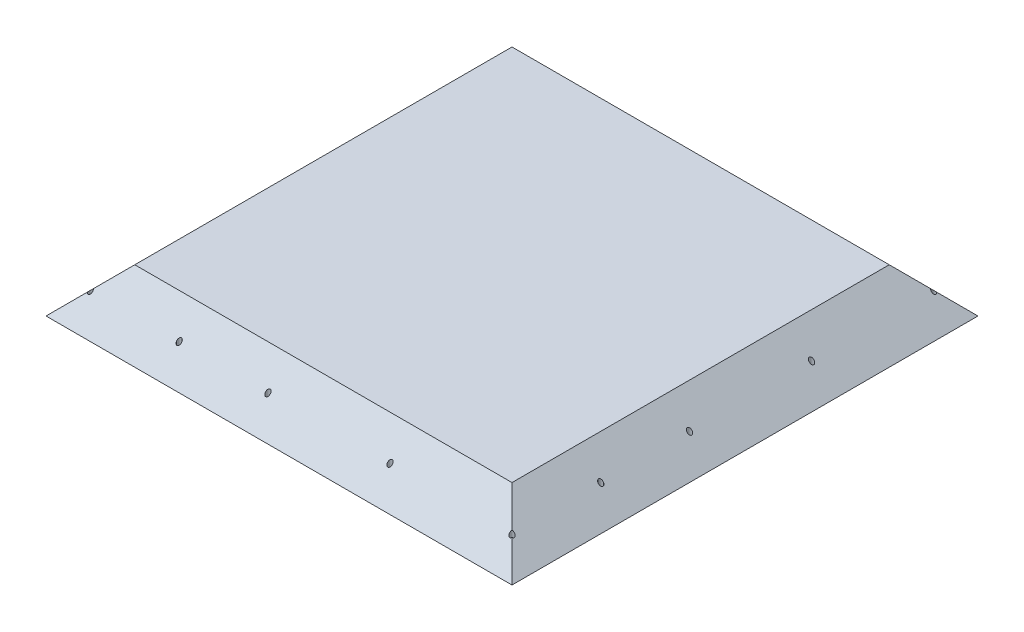
ISO-10303-21;
HEADER;
FILE_DESCRIPTION(('STEP AP214'),'2;1');
FILE_NAME('part.step','',(''),(''),'','','');
FILE_SCHEMA(('AUTOMOTIVE_DESIGN { 1 0 10303 214 1 1 1 1 }'));
ENDSEC;
DATA;
#1=APPLICATION_CONTEXT('core data for automotive mechanical design processes');
#2=APPLICATION_PROTOCOL_DEFINITION('international standard','automotive_design',2000,#1);
#3=PRODUCT_CONTEXT('',#1,'mechanical');
#4=PRODUCT('Part','Part','',(#3));
#5=PRODUCT_RELATED_PRODUCT_CATEGORY('part','',(#4));
#6=PRODUCT_DEFINITION_FORMATION('','',#4);
#7=PRODUCT_DEFINITION_CONTEXT('part definition',#1,'design');
#8=PRODUCT_DEFINITION('design','',#6,#7);
#9=PRODUCT_DEFINITION_SHAPE('','',#8);
#10=(LENGTH_UNIT() NAMED_UNIT(*) SI_UNIT(.MILLI.,.METRE.));
#11=(NAMED_UNIT(*) PLANE_ANGLE_UNIT() SI_UNIT($,.RADIAN.));
#12=(NAMED_UNIT(*) SI_UNIT($,.STERADIAN.) SOLID_ANGLE_UNIT());
#13=UNCERTAINTY_MEASURE_WITH_UNIT(LENGTH_MEASURE(1.E-05),#10,'distance_accuracy_value','');
#14=(GEOMETRIC_REPRESENTATION_CONTEXT(3) GLOBAL_UNCERTAINTY_ASSIGNED_CONTEXT((#13)) GLOBAL_UNIT_ASSIGNED_CONTEXT((#10,
#11,#12)) REPRESENTATION_CONTEXT('',''));
#15=CARTESIAN_POINT('',(0.,0.,0.));
#16=DIRECTION('',(0.,0.,1.));
#17=DIRECTION('',(1.,0.,0.));
#18=AXIS2_PLACEMENT_3D('',#15,#16,#17);
#19=CARTESIAN_POINT('',(0.,20.,0.));
#20=DIRECTION('',(0.,-1.,0.));
#21=DIRECTION('',(0.,0.,-1.));
#22=AXIS2_PLACEMENT_3D('',#19,#20,#21);
#23=PLANE('',#22);
#24=DIRECTION('',(0.,0.,1.));
#25=VECTOR('',#24,1.);
#26=CARTESIAN_POINT('',(20.,20.,0.));
#27=LINE('',#26,#25);
#28=CARTESIAN_POINT('',(20.,20.,-190.));
#29=VERTEX_POINT('',#28);
#30=CARTESIAN_POINT('',(20.,20.,-20.));
#31=VERTEX_POINT('',#30);
#32=EDGE_CURVE('E144',#29,#31,#27,.T.);
#33=ORIENTED_EDGE('',*,*,#32,.T.);
#34=DIRECTION('',(1.,0.,0.));
#35=VECTOR('',#34,1.);
#36=CARTESIAN_POINT('',(0.,20.,-20.));
#37=LINE('',#36,#35);
#38=CARTESIAN_POINT('',(190.,20.,-20.));
#39=VERTEX_POINT('',#38);
#40=EDGE_CURVE('E148',#31,#39,#37,.T.);
#41=ORIENTED_EDGE('',*,*,#40,.T.);
#42=DIRECTION('',(0.,0.,-1.));
#43=VECTOR('',#42,1.);
#44=CARTESIAN_POINT('',(190.,20.,0.));
#45=LINE('',#44,#43);
#46=CARTESIAN_POINT('',(190.,20.,-190.));
#47=VERTEX_POINT('',#46);
#48=EDGE_CURVE('E146',#39,#47,#45,.T.);
#49=ORIENTED_EDGE('',*,*,#48,.T.);
#50=DIRECTION('',(-1.,0.,0.));
#51=VECTOR('',#50,1.);
#52=CARTESIAN_POINT('',(0.,20.,-190.));
#53=LINE('',#52,#51);
#54=EDGE_CURVE('E141',#47,#29,#53,.T.);
#55=ORIENTED_EDGE('',*,*,#54,.T.);
#56=EDGE_LOOP('',(#33,#41,#49,#55));
#57=FACE_BOUND('',#56,.T.);
#58=ADVANCED_FACE('F42',(#57),#23,.F.);
#59=CARTESIAN_POINT('',(0.,0.,0.));
#60=DIRECTION('',(0.,-1.,0.));
#61=DIRECTION('',(0.,0.,-1.));
#62=AXIS2_PLACEMENT_3D('',#59,#60,#61);
#63=PLANE('',#62);
#64=DIRECTION('',(0.,0.,1.));
#65=VECTOR('',#64,1.);
#66=CARTESIAN_POINT('',(0.,0.,0.));
#67=LINE('',#66,#65);
#68=CARTESIAN_POINT('',(0.,0.,-210.));
#69=VERTEX_POINT('',#68);
#70=CARTESIAN_POINT('',(0.,0.,0.));
#71=VERTEX_POINT('',#70);
#72=EDGE_CURVE('E122',#69,#71,#67,.T.);
#73=ORIENTED_EDGE('',*,*,#72,.F.);
#74=DIRECTION('',(-1.,0.,0.));
#75=VECTOR('',#74,1.);
#76=CARTESIAN_POINT('',(0.,0.,-210.));
#77=LINE('',#76,#75);
#78=CARTESIAN_POINT('',(210.,0.,-210.));
#79=VERTEX_POINT('',#78);
#80=EDGE_CURVE('E136',#79,#69,#77,.T.);
#81=ORIENTED_EDGE('',*,*,#80,.F.);
#82=DIRECTION('',(0.,0.,-1.));
#83=VECTOR('',#82,1.);
#84=CARTESIAN_POINT('',(210.,0.,0.));
#85=LINE('',#84,#83);
#86=CARTESIAN_POINT('',(210.,0.,0.));
#87=VERTEX_POINT('',#86);
#88=EDGE_CURVE('E134',#87,#79,#85,.T.);
#89=ORIENTED_EDGE('',*,*,#88,.F.);
#90=DIRECTION('',(1.,0.,0.));
#91=VECTOR('',#90,1.);
#92=CARTESIAN_POINT('',(0.,0.,0.));
#93=LINE('',#92,#91);
#94=EDGE_CURVE('E115',#71,#87,#93,.T.);
#95=ORIENTED_EDGE('',*,*,#94,.F.);
#96=EDGE_LOOP('',(#73,#81,#89,#95));
#97=FACE_BOUND('',#96,.T.);
#98=ADVANCED_FACE('F132',(#97),#63,.T.);
#99=CARTESIAN_POINT('',(10.,3.,-10.));
#100=DIRECTION('',(0.,1.,0.));
#101=DIRECTION('',(0.,0.,1.));
#102=AXIS2_PLACEMENT_3D('',#99,#100,#101);
#103=CYLINDRICAL_SURFACE('',#102,0.999999999999999);
#104=CARTESIAN_POINT('',(10.,9.99999999999996,-10.));
#105=DIRECTION('',(0.707106781186549,-0.707106781186547,0.));
#106=DIRECTION('',(0.707106781186547,0.707106781186549,0.));
#107=AXIS2_PLACEMENT_3D('',#104,#105,#106);
#108=ELLIPSE('',#107,1.4142135623731,0.999999999999999);
#109=CARTESIAN_POINT('',(9.29289321881345,9.29289321881341,-9.29289321881345));
#110=VERTEX_POINT('',#109);
#111=CARTESIAN_POINT('',(10.7071067811865,10.7071067811865,-10.7071067811865));
#112=VERTEX_POINT('',#111);
#113=EDGE_CURVE('E151',#110,#112,#108,.T.);
#114=ORIENTED_EDGE('',*,*,#113,.F.);
#115=CARTESIAN_POINT('',(10.,9.99999999999996,-10.));
#116=DIRECTION('',(0.,-0.707106781186547,-0.707106781186549));
#117=DIRECTION('',(0.,0.707106781186549,-0.707106781186547));
#118=AXIS2_PLACEMENT_3D('',#115,#116,#117);
#119=ELLIPSE('',#118,1.4142135623731,0.999999999999999);
#120=EDGE_CURVE('E118',#110,#112,#119,.F.);
#121=ORIENTED_EDGE('',*,*,#120,.T.);
#122=EDGE_LOOP('',(#114,#121));
#123=FACE_BOUND('',#122,.T.);
#124=CARTESIAN_POINT('',(10.,3.,-10.));
#125=DIRECTION('',(0.,1.,0.));
#126=DIRECTION('',(0.,0.,1.));
#127=AXIS2_PLACEMENT_3D('',#124,#125,#126);
#128=CIRCLE('',#127,0.999999999999999);
#129=CARTESIAN_POINT('',(10.,3.,-9.));
#130=VERTEX_POINT('',#129);
#131=EDGE_CURVE('E130',#130,#130,#128,.T.);
#132=ORIENTED_EDGE('',*,*,#131,.F.);
#133=EDGE_LOOP('',(#132));
#134=FACE_BOUND('',#133,.T.);
#135=ADVANCED_FACE('F244',(#123,#134),#103,.F.);
#136=CARTESIAN_POINT('',(10.,3.,-10.));
#137=DIRECTION('',(0.,1.,0.));
#138=DIRECTION('',(0.,0.,1.));
#139=AXIS2_PLACEMENT_3D('',#136,#137,#138);
#140=PLANE('',#139);
#141=ORIENTED_EDGE('',*,*,#131,.T.);
#142=EDGE_LOOP('',(#141));
#143=FACE_BOUND('',#142,.T.);
#144=ADVANCED_FACE('F242',(#143),#140,.T.);
#145=CARTESIAN_POINT('',(200.,3.,-50.));
#146=DIRECTION('',(0.,1.,0.));
#147=DIRECTION('',(0.,0.,1.));
#148=AXIS2_PLACEMENT_3D('',#145,#146,#147);
#149=CYLINDRICAL_SURFACE('',#148,0.999999999999998);
#150=CARTESIAN_POINT('',(200.,3.,-50.));
#151=DIRECTION('',(0.,1.,0.));
#152=DIRECTION('',(0.,0.,1.));
#153=AXIS2_PLACEMENT_3D('',#150,#151,#152);
#154=CIRCLE('',#153,0.999999999999998);
#155=CARTESIAN_POINT('',(200.,3.,-49.));
#156=VERTEX_POINT('',#155);
#157=EDGE_CURVE('E160',#156,#156,#154,.T.);
#158=ORIENTED_EDGE('',*,*,#157,.F.);
#159=EDGE_LOOP('',(#158));
#160=FACE_BOUND('',#159,.T.);
#161=CARTESIAN_POINT('',(200.,9.99999999999996,-50.));
#162=DIRECTION('',(-0.707106781186549,-0.707106781186547,0.));
#163=DIRECTION('',(-0.707106781186547,0.707106781186549,0.));
#164=AXIS2_PLACEMENT_3D('',#161,#162,#163);
#165=ELLIPSE('',#164,1.41421356237309,0.999999999999998);
#166=CARTESIAN_POINT('',(199.,11.,-50.));
#167=VERTEX_POINT('',#166);
#168=EDGE_CURVE('E165',#167,#167,#165,.F.);
#169=ORIENTED_EDGE('',*,*,#168,.T.);
#170=EDGE_LOOP('',(#169));
#171=FACE_BOUND('',#170,.T.);
#172=ADVANCED_FACE('F252',(#160,#171),#149,.F.);
#173=CARTESIAN_POINT('',(200.,3.,-50.));
#174=DIRECTION('',(0.,1.,0.));
#175=DIRECTION('',(0.,0.,1.));
#176=AXIS2_PLACEMENT_3D('',#173,#174,#175);
#177=PLANE('',#176);
#178=ORIENTED_EDGE('',*,*,#157,.T.);
#179=EDGE_LOOP('',(#178));
#180=FACE_BOUND('',#179,.T.);
#181=ADVANCED_FACE('F364',(#180),#177,.T.);
#182=CARTESIAN_POINT('',(200.,3.,-90.));
#183=DIRECTION('',(0.,1.,0.));
#184=DIRECTION('',(0.,0.,1.));
#185=AXIS2_PLACEMENT_3D('',#182,#183,#184);
#186=CYLINDRICAL_SURFACE('',#185,0.999999999999998);
#187=CARTESIAN_POINT('',(200.,3.,-90.));
#188=DIRECTION('',(0.,1.,0.));
#189=DIRECTION('',(0.,0.,1.));
#190=AXIS2_PLACEMENT_3D('',#187,#188,#189);
#191=CIRCLE('',#190,0.999999999999998);
#192=CARTESIAN_POINT('',(200.,3.,-89.));
#193=VERTEX_POINT('',#192);
#194=EDGE_CURVE('E168',#193,#193,#191,.T.);
#195=ORIENTED_EDGE('',*,*,#194,.F.);
#196=EDGE_LOOP('',(#195));
#197=FACE_BOUND('',#196,.T.);
#198=CARTESIAN_POINT('',(200.,9.99999999999996,-90.));
#199=DIRECTION('',(-0.707106781186549,-0.707106781186547,0.));
#200=DIRECTION('',(-0.707106781186547,0.707106781186549,0.));
#201=AXIS2_PLACEMENT_3D('',#198,#199,#200);
#202=ELLIPSE('',#201,1.41421356237309,0.999999999999998);
#203=CARTESIAN_POINT('',(199.,11.,-90.));
#204=VERTEX_POINT('',#203);
#205=EDGE_CURVE('E169',#204,#204,#202,.F.);
#206=ORIENTED_EDGE('',*,*,#205,.T.);
#207=EDGE_LOOP('',(#206));
#208=FACE_BOUND('',#207,.T.);
#209=ADVANCED_FACE('F367',(#197,#208),#186,.F.);
#210=CARTESIAN_POINT('',(200.,3.,-90.));
#211=DIRECTION('',(0.,1.,0.));
#212=DIRECTION('',(0.,0.,1.));
#213=AXIS2_PLACEMENT_3D('',#210,#211,#212);
#214=PLANE('',#213);
#215=ORIENTED_EDGE('',*,*,#194,.T.);
#216=EDGE_LOOP('',(#215));
#217=FACE_BOUND('',#216,.T.);
#218=ADVANCED_FACE('F372',(#217),#214,.T.);
#219=CARTESIAN_POINT('',(200.,3.,-145.));
#220=DIRECTION('',(0.,1.,0.));
#221=DIRECTION('',(0.,0.,1.));
#222=AXIS2_PLACEMENT_3D('',#219,#220,#221);
#223=CYLINDRICAL_SURFACE('',#222,0.999999999999998);
#224=CARTESIAN_POINT('',(200.,3.,-145.));
#225=DIRECTION('',(0.,1.,0.));
#226=DIRECTION('',(0.,0.,1.));
#227=AXIS2_PLACEMENT_3D('',#224,#225,#226);
#228=CIRCLE('',#227,0.999999999999998);
#229=CARTESIAN_POINT('',(200.,3.,-144.));
#230=VERTEX_POINT('',#229);
#231=EDGE_CURVE('E172',#230,#230,#228,.T.);
#232=ORIENTED_EDGE('',*,*,#231,.F.);
#233=EDGE_LOOP('',(#232));
#234=FACE_BOUND('',#233,.T.);
#235=CARTESIAN_POINT('',(200.,9.99999999999996,-145.));
#236=DIRECTION('',(-0.707106781186549,-0.707106781186547,0.));
#237=DIRECTION('',(-0.707106781186547,0.707106781186549,0.));
#238=AXIS2_PLACEMENT_3D('',#235,#236,#237);
#239=ELLIPSE('',#238,1.41421356237309,0.999999999999998);
#240=CARTESIAN_POINT('',(199.,11.,-145.));
#241=VERTEX_POINT('',#240);
#242=EDGE_CURVE('E173',#241,#241,#239,.F.);
#243=ORIENTED_EDGE('',*,*,#242,.T.);
#244=EDGE_LOOP('',(#243));
#245=FACE_BOUND('',#244,.T.);
#246=ADVANCED_FACE('F375',(#234,#245),#223,.F.);
#247=CARTESIAN_POINT('',(200.,3.,-145.));
#248=DIRECTION('',(0.,1.,0.));
#249=DIRECTION('',(0.,0.,1.));
#250=AXIS2_PLACEMENT_3D('',#247,#248,#249);
#251=PLANE('',#250);
#252=ORIENTED_EDGE('',*,*,#231,.T.);
#253=EDGE_LOOP('',(#252));
#254=FACE_BOUND('',#253,.T.);
#255=ADVANCED_FACE('F380',(#254),#251,.T.);
#256=CARTESIAN_POINT('',(145.,3.,-10.));
#257=DIRECTION('',(0.,1.,0.));
#258=DIRECTION('',(0.,0.,1.));
#259=AXIS2_PLACEMENT_3D('',#256,#257,#258);
#260=CYLINDRICAL_SURFACE('',#259,0.999999999999998);
#261=CARTESIAN_POINT('',(145.,3.,-10.));
#262=DIRECTION('',(0.,1.,0.));
#263=DIRECTION('',(0.,0.,1.));
#264=AXIS2_PLACEMENT_3D('',#261,#262,#263);
#265=CIRCLE('',#264,0.999999999999998);
#266=CARTESIAN_POINT('',(145.,3.,-9.));
#267=VERTEX_POINT('',#266);
#268=EDGE_CURVE('E176',#267,#267,#265,.T.);
#269=ORIENTED_EDGE('',*,*,#268,.F.);
#270=EDGE_LOOP('',(#269));
#271=FACE_BOUND('',#270,.T.);
#272=CARTESIAN_POINT('',(145.,9.99999999999996,-10.));
#273=DIRECTION('',(0.,-0.707106781186547,-0.707106781186549));
#274=DIRECTION('',(0.,0.707106781186549,-0.707106781186547));
#275=AXIS2_PLACEMENT_3D('',#272,#273,#274);
#276=ELLIPSE('',#275,1.41421356237309,0.999999999999998);
#277=CARTESIAN_POINT('',(145.,11.,-11.));
#278=VERTEX_POINT('',#277);
#279=EDGE_CURVE('E177',#278,#278,#276,.F.);
#280=ORIENTED_EDGE('',*,*,#279,.T.);
#281=EDGE_LOOP('',(#280));
#282=FACE_BOUND('',#281,.T.);
#283=ADVANCED_FACE('F383',(#271,#282),#260,.F.);
#284=CARTESIAN_POINT('',(145.,3.,-10.));
#285=DIRECTION('',(0.,1.,0.));
#286=DIRECTION('',(0.,0.,1.));
#287=AXIS2_PLACEMENT_3D('',#284,#285,#286);
#288=PLANE('',#287);
#289=ORIENTED_EDGE('',*,*,#268,.T.);
#290=EDGE_LOOP('',(#289));
#291=FACE_BOUND('',#290,.T.);
#292=ADVANCED_FACE('F388',(#291),#288,.T.);
#293=CARTESIAN_POINT('',(90.,3.,-10.));
#294=DIRECTION('',(0.,1.,0.));
#295=DIRECTION('',(0.,0.,1.));
#296=AXIS2_PLACEMENT_3D('',#293,#294,#295);
#297=CYLINDRICAL_SURFACE('',#296,0.999999999999998);
#298=CARTESIAN_POINT('',(90.,3.,-10.));
#299=DIRECTION('',(0.,1.,0.));
#300=DIRECTION('',(0.,0.,1.));
#301=AXIS2_PLACEMENT_3D('',#298,#299,#300);
#302=CIRCLE('',#301,0.999999999999998);
#303=CARTESIAN_POINT('',(90.,3.,-9.));
#304=VERTEX_POINT('',#303);
#305=EDGE_CURVE('E180',#304,#304,#302,.T.);
#306=ORIENTED_EDGE('',*,*,#305,.F.);
#307=EDGE_LOOP('',(#306));
#308=FACE_BOUND('',#307,.T.);
#309=CARTESIAN_POINT('',(90.,9.99999999999996,-10.));
#310=DIRECTION('',(0.,-0.707106781186547,-0.707106781186549));
#311=DIRECTION('',(0.,0.707106781186549,-0.707106781186547));
#312=AXIS2_PLACEMENT_3D('',#309,#310,#311);
#313=ELLIPSE('',#312,1.41421356237309,0.999999999999998);
#314=CARTESIAN_POINT('',(90.,11.,-11.));
#315=VERTEX_POINT('',#314);
#316=EDGE_CURVE('E181',#315,#315,#313,.F.);
#317=ORIENTED_EDGE('',*,*,#316,.T.);
#318=EDGE_LOOP('',(#317));
#319=FACE_BOUND('',#318,.T.);
#320=ADVANCED_FACE('F391',(#308,#319),#297,.F.);
#321=CARTESIAN_POINT('',(90.,3.,-10.));
#322=DIRECTION('',(0.,1.,0.));
#323=DIRECTION('',(0.,0.,1.));
#324=AXIS2_PLACEMENT_3D('',#321,#322,#323);
#325=PLANE('',#324);
#326=ORIENTED_EDGE('',*,*,#305,.T.);
#327=EDGE_LOOP('',(#326));
#328=FACE_BOUND('',#327,.T.);
#329=ADVANCED_FACE('F396',(#328),#325,.T.);
#330=CARTESIAN_POINT('',(50.,3.,-10.));
#331=DIRECTION('',(0.,1.,0.));
#332=DIRECTION('',(0.,0.,1.));
#333=AXIS2_PLACEMENT_3D('',#330,#331,#332);
#334=CYLINDRICAL_SURFACE('',#333,0.999999999999998);
#335=CARTESIAN_POINT('',(50.,3.,-10.));
#336=DIRECTION('',(0.,1.,0.));
#337=DIRECTION('',(0.,0.,1.));
#338=AXIS2_PLACEMENT_3D('',#335,#336,#337);
#339=CIRCLE('',#338,0.999999999999998);
#340=CARTESIAN_POINT('',(50.,3.,-9.));
#341=VERTEX_POINT('',#340);
#342=EDGE_CURVE('E184',#341,#341,#339,.T.);
#343=ORIENTED_EDGE('',*,*,#342,.F.);
#344=EDGE_LOOP('',(#343));
#345=FACE_BOUND('',#344,.T.);
#346=CARTESIAN_POINT('',(50.,9.99999999999996,-10.));
#347=DIRECTION('',(0.,-0.707106781186547,-0.707106781186549));
#348=DIRECTION('',(0.,0.707106781186549,-0.707106781186547));
#349=AXIS2_PLACEMENT_3D('',#346,#347,#348);
#350=ELLIPSE('',#349,1.41421356237309,0.999999999999998);
#351=CARTESIAN_POINT('',(50.,11.,-11.));
#352=VERTEX_POINT('',#351);
#353=EDGE_CURVE('E185',#352,#352,#350,.F.);
#354=ORIENTED_EDGE('',*,*,#353,.T.);
#355=EDGE_LOOP('',(#354));
#356=FACE_BOUND('',#355,.T.);
#357=ADVANCED_FACE('F399',(#345,#356),#334,.F.);
#358=CARTESIAN_POINT('',(50.,3.,-10.));
#359=DIRECTION('',(0.,1.,0.));
#360=DIRECTION('',(0.,0.,1.));
#361=AXIS2_PLACEMENT_3D('',#358,#359,#360);
#362=PLANE('',#361);
#363=ORIENTED_EDGE('',*,*,#342,.T.);
#364=EDGE_LOOP('',(#363));
#365=FACE_BOUND('',#364,.T.);
#366=ADVANCED_FACE('F404',(#365),#362,.T.);
#367=CARTESIAN_POINT('',(10.,3.,-120.));
#368=DIRECTION('',(0.,1.,0.));
#369=DIRECTION('',(0.,0.,1.));
#370=AXIS2_PLACEMENT_3D('',#367,#368,#369);
#371=CYLINDRICAL_SURFACE('',#370,1.);
#372=CARTESIAN_POINT('',(10.,3.,-120.));
#373=DIRECTION('',(0.,1.,0.));
#374=DIRECTION('',(0.,0.,1.));
#375=AXIS2_PLACEMENT_3D('',#372,#373,#374);
#376=CIRCLE('',#375,1.);
#377=CARTESIAN_POINT('',(10.,3.,-119.));
#378=VERTEX_POINT('',#377);
#379=EDGE_CURVE('E188',#378,#378,#376,.T.);
#380=ORIENTED_EDGE('',*,*,#379,.F.);
#381=EDGE_LOOP('',(#380));
#382=FACE_BOUND('',#381,.T.);
#383=CARTESIAN_POINT('',(10.,9.99999999999996,-120.));
#384=DIRECTION('',(0.707106781186549,-0.707106781186547,0.));
#385=DIRECTION('',(0.707106781186547,0.707106781186549,0.));
#386=AXIS2_PLACEMENT_3D('',#383,#384,#385);
#387=ELLIPSE('',#386,1.4142135623731,1.);
#388=CARTESIAN_POINT('',(11.,11.,-120.));
#389=VERTEX_POINT('',#388);
#390=EDGE_CURVE('E189',#389,#389,#387,.F.);
#391=ORIENTED_EDGE('',*,*,#390,.T.);
#392=EDGE_LOOP('',(#391));
#393=FACE_BOUND('',#392,.T.);
#394=ADVANCED_FACE('F407',(#382,#393),#371,.F.);
#395=CARTESIAN_POINT('',(10.,3.,-120.));
#396=DIRECTION('',(0.,1.,0.));
#397=DIRECTION('',(0.,0.,1.));
#398=AXIS2_PLACEMENT_3D('',#395,#396,#397);
#399=PLANE('',#398);
#400=ORIENTED_EDGE('',*,*,#379,.T.);
#401=EDGE_LOOP('',(#400));
#402=FACE_BOUND('',#401,.T.);
#403=ADVANCED_FACE('F326',(#402),#399,.T.);
#404=CARTESIAN_POINT('',(200.,3.,-10.));
#405=DIRECTION('',(0.,1.,0.));
#406=DIRECTION('',(0.,0.,1.));
#407=AXIS2_PLACEMENT_3D('',#404,#405,#406);
#408=CYLINDRICAL_SURFACE('',#407,0.999999999999998);
#409=CARTESIAN_POINT('',(200.,3.,-10.));
#410=DIRECTION('',(0.,1.,0.));
#411=DIRECTION('',(0.,0.,1.));
#412=AXIS2_PLACEMENT_3D('',#409,#410,#411);
#413=CIRCLE('',#412,0.999999999999998);
#414=CARTESIAN_POINT('',(200.,3.,-9.));
#415=VERTEX_POINT('',#414);
#416=EDGE_CURVE('E195',#415,#415,#413,.T.);
#417=ORIENTED_EDGE('',*,*,#416,.F.);
#418=EDGE_LOOP('',(#417));
#419=FACE_BOUND('',#418,.T.);
#420=CARTESIAN_POINT('',(200.,9.99999999999996,-10.));
#421=DIRECTION('',(0.,-0.707106781186547,-0.707106781186549));
#422=DIRECTION('',(0.,0.707106781186549,-0.707106781186547));
#423=AXIS2_PLACEMENT_3D('',#420,#421,#422);
#424=ELLIPSE('',#423,1.41421356237309,0.999999999999998);
#425=CARTESIAN_POINT('',(199.292893218813,10.7071067811865,-10.7071067811865));
#426=VERTEX_POINT('',#425);
#427=CARTESIAN_POINT('',(200.707106781187,9.29289321881341,-9.29289321881345));
#428=VERTEX_POINT('',#427);
#429=EDGE_CURVE('E162',#426,#428,#424,.F.);
#430=ORIENTED_EDGE('',*,*,#429,.T.);
#431=CARTESIAN_POINT('',(200.,9.99999999999996,-10.));
#432=DIRECTION('',(-0.707106781186549,-0.707106781186547,0.));
#433=DIRECTION('',(-0.707106781186547,0.707106781186549,0.));
#434=AXIS2_PLACEMENT_3D('',#431,#432,#433);
#435=ELLIPSE('',#434,1.41421356237309,0.999999999999998);
#436=EDGE_CURVE('E164',#428,#426,#435,.F.);
#437=ORIENTED_EDGE('',*,*,#436,.T.);
#438=EDGE_LOOP('',(#430,#437));
#439=FACE_BOUND('',#438,.T.);
#440=ADVANCED_FACE('F322',(#419,#439),#408,.F.);
#441=CARTESIAN_POINT('',(200.,3.,-10.));
#442=DIRECTION('',(0.,1.,0.));
#443=DIRECTION('',(0.,0.,1.));
#444=AXIS2_PLACEMENT_3D('',#441,#442,#443);
#445=PLANE('',#444);
#446=ORIENTED_EDGE('',*,*,#416,.T.);
#447=EDGE_LOOP('',(#446));
#448=FACE_BOUND('',#447,.T.);
#449=ADVANCED_FACE('F325',(#448),#445,.T.);
#450=CARTESIAN_POINT('',(200.,3.,-200.));
#451=DIRECTION('',(0.,1.,0.));
#452=DIRECTION('',(0.,0.,1.));
#453=AXIS2_PLACEMENT_3D('',#450,#451,#452);
#454=CYLINDRICAL_SURFACE('',#453,0.999999999999998);
#455=CARTESIAN_POINT('',(200.,9.99999999999996,-200.));
#456=DIRECTION('',(-0.707106781186549,-0.707106781186547,0.));
#457=DIRECTION('',(-0.707106781186547,0.707106781186549,0.));
#458=AXIS2_PLACEMENT_3D('',#455,#456,#457);
#459=ELLIPSE('',#458,1.41421356237309,0.999999999999998);
#460=CARTESIAN_POINT('',(200.707106781187,9.2928932188134,-200.707106781187));
#461=VERTEX_POINT('',#460);
#462=CARTESIAN_POINT('',(199.292893218813,10.7071067811865,-199.292893218813));
#463=VERTEX_POINT('',#462);
#464=EDGE_CURVE('E52',#461,#463,#459,.T.);
#465=ORIENTED_EDGE('',*,*,#464,.F.);
#466=CARTESIAN_POINT('',(200.,9.99999999999996,-200.));
#467=DIRECTION('',(0.,-0.707106781186547,0.707106781186549));
#468=DIRECTION('',(0.,0.707106781186549,0.707106781186547));
#469=AXIS2_PLACEMENT_3D('',#466,#467,#468);
#470=ELLIPSE('',#469,1.41421356237309,0.999999999999998);
#471=EDGE_CURVE('E197',#461,#463,#470,.F.);
#472=ORIENTED_EDGE('',*,*,#471,.T.);
#473=EDGE_LOOP('',(#465,#472));
#474=FACE_BOUND('',#473,.T.);
#475=CARTESIAN_POINT('',(200.,3.,-200.));
#476=DIRECTION('',(0.,1.,0.));
#477=DIRECTION('',(0.,0.,1.));
#478=AXIS2_PLACEMENT_3D('',#475,#476,#477);
#479=CIRCLE('',#478,0.999999999999998);
#480=CARTESIAN_POINT('',(200.,3.,-199.));
#481=VERTEX_POINT('',#480);
#482=EDGE_CURVE('E200',#481,#481,#479,.T.);
#483=ORIENTED_EDGE('',*,*,#482,.F.);
#484=EDGE_LOOP('',(#483));
#485=FACE_BOUND('',#484,.T.);
#486=ADVANCED_FACE('F330',(#474,#485),#454,.F.);
#487=CARTESIAN_POINT('',(200.,3.,-200.));
#488=DIRECTION('',(0.,1.,0.));
#489=DIRECTION('',(0.,0.,1.));
#490=AXIS2_PLACEMENT_3D('',#487,#488,#489);
#491=PLANE('',#490);
#492=ORIENTED_EDGE('',*,*,#482,.T.);
#493=EDGE_LOOP('',(#492));
#494=FACE_BOUND('',#493,.T.);
#495=ADVANCED_FACE('F334',(#494),#491,.T.);
#496=CARTESIAN_POINT('',(10.,3.,-200.));
#497=DIRECTION('',(0.,1.,0.));
#498=DIRECTION('',(0.,0.,1.));
#499=AXIS2_PLACEMENT_3D('',#496,#497,#498);
#500=CYLINDRICAL_SURFACE('',#499,1.);
#501=CARTESIAN_POINT('',(10.,9.99999999999996,-200.));
#502=DIRECTION('',(0.707106781186549,-0.707106781186547,0.));
#503=DIRECTION('',(0.707106781186547,0.707106781186549,0.));
#504=AXIS2_PLACEMENT_3D('',#501,#502,#503);
#505=ELLIPSE('',#504,1.4142135623731,1.);
#506=CARTESIAN_POINT('',(10.7071067811866,10.7071067811865,-199.292893218813));
#507=VERTEX_POINT('',#506);
#508=CARTESIAN_POINT('',(9.29289321881346,9.29289321881341,-200.707106781187));
#509=VERTEX_POINT('',#508);
#510=EDGE_CURVE('E11',#507,#509,#505,.T.);
#511=ORIENTED_EDGE('',*,*,#510,.F.);
#512=CARTESIAN_POINT('',(10.,9.99999999999996,-200.));
#513=DIRECTION('',(0.,-0.707106781186547,0.707106781186549));
#514=DIRECTION('',(0.,0.707106781186549,0.707106781186547));
#515=AXIS2_PLACEMENT_3D('',#512,#513,#514);
#516=ELLIPSE('',#515,1.4142135623731,1.);
#517=EDGE_CURVE('E202',#507,#509,#516,.F.);
#518=ORIENTED_EDGE('',*,*,#517,.T.);
#519=EDGE_LOOP('',(#511,#518));
#520=FACE_BOUND('',#519,.T.);
#521=CARTESIAN_POINT('',(10.,3.,-200.));
#522=DIRECTION('',(0.,1.,0.));
#523=DIRECTION('',(0.,0.,1.));
#524=AXIS2_PLACEMENT_3D('',#521,#522,#523);
#525=CIRCLE('',#524,1.);
#526=CARTESIAN_POINT('',(10.,3.,-199.));
#527=VERTEX_POINT('',#526);
#528=EDGE_CURVE('E203',#527,#527,#525,.T.);
#529=ORIENTED_EDGE('',*,*,#528,.F.);
#530=EDGE_LOOP('',(#529));
#531=FACE_BOUND('',#530,.T.);
#532=ADVANCED_FACE('F338',(#520,#531),#500,.F.);
#533=CARTESIAN_POINT('',(10.,3.,-200.));
#534=DIRECTION('',(0.,1.,0.));
#535=DIRECTION('',(0.,0.,1.));
#536=AXIS2_PLACEMENT_3D('',#533,#534,#535);
#537=PLANE('',#536);
#538=ORIENTED_EDGE('',*,*,#528,.T.);
#539=EDGE_LOOP('',(#538));
#540=FACE_BOUND('',#539,.T.);
#541=ADVANCED_FACE('F342',(#540),#537,.T.);
#542=CARTESIAN_POINT('',(65.,3.,-200.));
#543=DIRECTION('',(0.,1.,0.));
#544=DIRECTION('',(0.,0.,1.));
#545=AXIS2_PLACEMENT_3D('',#542,#543,#544);
#546=CYLINDRICAL_SURFACE('',#545,0.999999999999998);
#547=CARTESIAN_POINT('',(65.,3.,-200.));
#548=DIRECTION('',(0.,1.,0.));
#549=DIRECTION('',(0.,0.,1.));
#550=AXIS2_PLACEMENT_3D('',#547,#548,#549);
#551=CIRCLE('',#550,0.999999999999998);
#552=CARTESIAN_POINT('',(65.,3.,-199.));
#553=VERTEX_POINT('',#552);
#554=EDGE_CURVE('E208',#553,#553,#551,.T.);
#555=ORIENTED_EDGE('',*,*,#554,.F.);
#556=EDGE_LOOP('',(#555));
#557=FACE_BOUND('',#556,.T.);
#558=CARTESIAN_POINT('',(65.,9.99999999999996,-200.));
#559=DIRECTION('',(0.,-0.707106781186547,0.707106781186549));
#560=DIRECTION('',(0.,0.707106781186549,0.707106781186547));
#561=AXIS2_PLACEMENT_3D('',#558,#559,#560);
#562=ELLIPSE('',#561,1.41421356237309,0.999999999999998);
#563=CARTESIAN_POINT('',(65.,11.,-199.));
#564=VERTEX_POINT('',#563);
#565=EDGE_CURVE('E205',#564,#564,#562,.F.);
#566=ORIENTED_EDGE('',*,*,#565,.T.);
#567=EDGE_LOOP('',(#566));
#568=FACE_BOUND('',#567,.T.);
#569=ADVANCED_FACE('F345',(#557,#568),#546,.F.);
#570=CARTESIAN_POINT('',(65.,3.,-200.));
#571=DIRECTION('',(0.,1.,0.));
#572=DIRECTION('',(0.,0.,1.));
#573=AXIS2_PLACEMENT_3D('',#570,#571,#572);
#574=PLANE('',#573);
#575=ORIENTED_EDGE('',*,*,#554,.T.);
#576=EDGE_LOOP('',(#575));
#577=FACE_BOUND('',#576,.T.);
#578=ADVANCED_FACE('F349',(#577),#574,.T.);
#579=CARTESIAN_POINT('',(120.,3.,-200.));
#580=DIRECTION('',(0.,1.,0.));
#581=DIRECTION('',(0.,0.,1.));
#582=AXIS2_PLACEMENT_3D('',#579,#580,#581);
#583=CYLINDRICAL_SURFACE('',#582,0.999999999999998);
#584=CARTESIAN_POINT('',(120.,3.,-200.));
#585=DIRECTION('',(0.,1.,0.));
#586=DIRECTION('',(0.,0.,1.));
#587=AXIS2_PLACEMENT_3D('',#584,#585,#586);
#588=CIRCLE('',#587,0.999999999999998);
#589=CARTESIAN_POINT('',(120.,3.,-199.));
#590=VERTEX_POINT('',#589);
#591=EDGE_CURVE('E212',#590,#590,#588,.T.);
#592=ORIENTED_EDGE('',*,*,#591,.F.);
#593=EDGE_LOOP('',(#592));
#594=FACE_BOUND('',#593,.T.);
#595=CARTESIAN_POINT('',(120.,9.99999999999996,-200.));
#596=DIRECTION('',(0.,-0.707106781186547,0.707106781186549));
#597=DIRECTION('',(0.,0.707106781186549,0.707106781186547));
#598=AXIS2_PLACEMENT_3D('',#595,#596,#597);
#599=ELLIPSE('',#598,1.41421356237309,0.999999999999998);
#600=CARTESIAN_POINT('',(120.,11.,-199.));
#601=VERTEX_POINT('',#600);
#602=EDGE_CURVE('E209',#601,#601,#599,.F.);
#603=ORIENTED_EDGE('',*,*,#602,.T.);
#604=EDGE_LOOP('',(#603));
#605=FACE_BOUND('',#604,.T.);
#606=ADVANCED_FACE('F307',(#594,#605),#583,.F.);
#607=CARTESIAN_POINT('',(120.,3.,-200.));
#608=DIRECTION('',(0.,1.,0.));
#609=DIRECTION('',(0.,0.,1.));
#610=AXIS2_PLACEMENT_3D('',#607,#608,#609);
#611=PLANE('',#610);
#612=ORIENTED_EDGE('',*,*,#591,.T.);
#613=EDGE_LOOP('',(#612));
#614=FACE_BOUND('',#613,.T.);
#615=ADVANCED_FACE('F297',(#614),#611,.T.);
#616=CARTESIAN_POINT('',(160.,3.,-200.));
#617=DIRECTION('',(0.,1.,0.));
#618=DIRECTION('',(0.,0.,1.));
#619=AXIS2_PLACEMENT_3D('',#616,#617,#618);
#620=CYLINDRICAL_SURFACE('',#619,0.999999999999998);
#621=CARTESIAN_POINT('',(160.,3.,-200.));
#622=DIRECTION('',(0.,1.,0.));
#623=DIRECTION('',(0.,0.,1.));
#624=AXIS2_PLACEMENT_3D('',#621,#622,#623);
#625=CIRCLE('',#624,0.999999999999998);
#626=CARTESIAN_POINT('',(160.,3.,-199.));
#627=VERTEX_POINT('',#626);
#628=EDGE_CURVE('E215',#627,#627,#625,.T.);
#629=ORIENTED_EDGE('',*,*,#628,.F.);
#630=EDGE_LOOP('',(#629));
#631=FACE_BOUND('',#630,.T.);
#632=CARTESIAN_POINT('',(160.,9.99999999999996,-200.));
#633=DIRECTION('',(0.,-0.707106781186547,0.707106781186549));
#634=DIRECTION('',(0.,0.707106781186549,0.707106781186547));
#635=AXIS2_PLACEMENT_3D('',#632,#633,#634);
#636=ELLIPSE('',#635,1.41421356237309,0.999999999999998);
#637=CARTESIAN_POINT('',(160.,11.,-199.));
#638=VERTEX_POINT('',#637);
#639=EDGE_CURVE('E213',#638,#638,#636,.F.);
#640=ORIENTED_EDGE('',*,*,#639,.T.);
#641=EDGE_LOOP('',(#640));
#642=FACE_BOUND('',#641,.T.);
#643=ADVANCED_FACE('F294',(#631,#642),#620,.F.);
#644=CARTESIAN_POINT('',(160.,3.,-200.));
#645=DIRECTION('',(0.,1.,0.));
#646=DIRECTION('',(0.,0.,1.));
#647=AXIS2_PLACEMENT_3D('',#644,#645,#646);
#648=PLANE('',#647);
#649=ORIENTED_EDGE('',*,*,#628,.T.);
#650=EDGE_LOOP('',(#649));
#651=FACE_BOUND('',#650,.T.);
#652=ADVANCED_FACE('F296',(#651),#648,.T.);
#653=CARTESIAN_POINT('',(10.,3.,-160.));
#654=DIRECTION('',(0.,1.,0.));
#655=DIRECTION('',(0.,0.,1.));
#656=AXIS2_PLACEMENT_3D('',#653,#654,#655);
#657=CYLINDRICAL_SURFACE('',#656,1.);
#658=CARTESIAN_POINT('',(10.,3.,-160.));
#659=DIRECTION('',(0.,1.,0.));
#660=DIRECTION('',(0.,0.,1.));
#661=AXIS2_PLACEMENT_3D('',#658,#659,#660);
#662=CIRCLE('',#661,1.);
#663=CARTESIAN_POINT('',(10.,3.,-159.));
#664=VERTEX_POINT('',#663);
#665=EDGE_CURVE('E218',#664,#664,#662,.T.);
#666=ORIENTED_EDGE('',*,*,#665,.F.);
#667=EDGE_LOOP('',(#666));
#668=FACE_BOUND('',#667,.T.);
#669=CARTESIAN_POINT('',(10.,9.99999999999996,-160.));
#670=DIRECTION('',(0.707106781186549,-0.707106781186547,0.));
#671=DIRECTION('',(0.707106781186547,0.707106781186549,0.));
#672=AXIS2_PLACEMENT_3D('',#669,#670,#671);
#673=ELLIPSE('',#672,1.4142135623731,1.);
#674=CARTESIAN_POINT('',(11.,11.,-160.));
#675=VERTEX_POINT('',#674);
#676=EDGE_CURVE('E216',#675,#675,#673,.F.);
#677=ORIENTED_EDGE('',*,*,#676,.T.);
#678=EDGE_LOOP('',(#677));
#679=FACE_BOUND('',#678,.T.);
#680=ADVANCED_FACE('F304',(#668,#679),#657,.F.);
#681=CARTESIAN_POINT('',(10.,3.,-160.));
#682=DIRECTION('',(0.,1.,0.));
#683=DIRECTION('',(0.,0.,1.));
#684=AXIS2_PLACEMENT_3D('',#681,#682,#683);
#685=PLANE('',#684);
#686=ORIENTED_EDGE('',*,*,#665,.T.);
#687=EDGE_LOOP('',(#686));
#688=FACE_BOUND('',#687,.T.);
#689=ADVANCED_FACE('F315',(#688),#685,.T.);
#690=CARTESIAN_POINT('',(10.,3.,-65.));
#691=DIRECTION('',(0.,1.,0.));
#692=DIRECTION('',(0.,0.,1.));
#693=AXIS2_PLACEMENT_3D('',#690,#691,#692);
#694=CYLINDRICAL_SURFACE('',#693,1.);
#695=CARTESIAN_POINT('',(10.,3.,-65.));
#696=DIRECTION('',(0.,1.,0.));
#697=DIRECTION('',(0.,0.,1.));
#698=AXIS2_PLACEMENT_3D('',#695,#696,#697);
#699=CIRCLE('',#698,1.);
#700=CARTESIAN_POINT('',(10.,3.,-64.));
#701=VERTEX_POINT('',#700);
#702=EDGE_CURVE('E192',#701,#701,#699,.T.);
#703=ORIENTED_EDGE('',*,*,#702,.F.);
#704=EDGE_LOOP('',(#703));
#705=FACE_BOUND('',#704,.T.);
#706=CARTESIAN_POINT('',(10.,9.99999999999996,-65.));
#707=DIRECTION('',(0.707106781186549,-0.707106781186547,0.));
#708=DIRECTION('',(0.707106781186547,0.707106781186549,0.));
#709=AXIS2_PLACEMENT_3D('',#706,#707,#708);
#710=ELLIPSE('',#709,1.4142135623731,1.);
#711=CARTESIAN_POINT('',(11.,11.,-65.));
#712=VERTEX_POINT('',#711);
#713=EDGE_CURVE('E47',#712,#712,#710,.F.);
#714=ORIENTED_EDGE('',*,*,#713,.T.);
#715=EDGE_LOOP('',(#714));
#716=FACE_BOUND('',#715,.T.);
#717=ADVANCED_FACE('F284',(#705,#716),#694,.F.);
#718=CARTESIAN_POINT('',(10.,3.,-65.));
#719=DIRECTION('',(0.,1.,0.));
#720=DIRECTION('',(0.,0.,1.));
#721=AXIS2_PLACEMENT_3D('',#718,#719,#720);
#722=PLANE('',#721);
#723=ORIENTED_EDGE('',*,*,#702,.T.);
#724=EDGE_LOOP('',(#723));
#725=FACE_BOUND('',#724,.T.);
#726=ADVANCED_FACE('F279',(#725),#722,.T.);
#727=CARTESIAN_POINT('',(0.,20.,-190.));
#728=DIRECTION('',(0.,-0.707106781186547,0.707106781186549));
#729=DIRECTION('',(-1.,0.,0.));
#730=AXIS2_PLACEMENT_3D('',#727,#728,#729);
#731=PLANE('',#730);
#732=DIRECTION('',(0.577350269189625,0.577350269189627,0.577350269189625));
#733=VECTOR('',#732,1.);
#734=CARTESIAN_POINT('',(13.3333333333334,13.3333333333333,-196.666666666667));
#735=LINE('',#734,#733);
#736=EDGE_CURVE('E126',#509,#69,#735,.F.);
#737=ORIENTED_EDGE('',*,*,#736,.F.);
#738=ORIENTED_EDGE('',*,*,#517,.F.);
#739=EDGE_CURVE('E158',#29,#507,#735,.F.);
#740=ORIENTED_EDGE('',*,*,#739,.F.);
#741=ORIENTED_EDGE('',*,*,#54,.F.);
#742=DIRECTION('',(0.577350269189625,-0.577350269189627,-0.577350269189625));
#743=VECTOR('',#742,1.);
#744=CARTESIAN_POINT('',(126.666666666667,83.3333333333334,-126.666666666667));
#745=LINE('',#744,#743);
#746=EDGE_CURVE('E155',#463,#47,#745,.F.);
#747=ORIENTED_EDGE('',*,*,#746,.F.);
#748=ORIENTED_EDGE('',*,*,#471,.F.);
#749=EDGE_CURVE('E154',#79,#461,#745,.F.);
#750=ORIENTED_EDGE('',*,*,#749,.F.);
#751=ORIENTED_EDGE('',*,*,#80,.T.);
#752=EDGE_LOOP('',(#737,#738,#740,#741,#747,#748,#750,#751));
#753=FACE_BOUND('',#752,.T.);
#754=ORIENTED_EDGE('',*,*,#565,.F.);
#755=EDGE_LOOP('',(#754));
#756=FACE_BOUND('',#755,.T.);
#757=ORIENTED_EDGE('',*,*,#602,.F.);
#758=EDGE_LOOP('',(#757));
#759=FACE_BOUND('',#758,.T.);
#760=ORIENTED_EDGE('',*,*,#639,.F.);
#761=EDGE_LOOP('',(#760));
#762=FACE_BOUND('',#761,.T.);
#763=ADVANCED_FACE('F45',(#753,#756,#759,#762),#731,.F.);
#764=CARTESIAN_POINT('',(20.,20.,0.));
#765=DIRECTION('',(0.707106781186549,-0.707106781186547,0.));
#766=DIRECTION('',(0.,0.,1.));
#767=AXIS2_PLACEMENT_3D('',#764,#765,#766);
#768=PLANE('',#767);
#769=ORIENTED_EDGE('',*,*,#739,.T.);
#770=ORIENTED_EDGE('',*,*,#510,.T.);
#771=ORIENTED_EDGE('',*,*,#736,.T.);
#772=ORIENTED_EDGE('',*,*,#72,.T.);
#773=DIRECTION('',(0.577350269189625,0.577350269189627,-0.577350269189625));
#774=VECTOR('',#773,1.);
#775=CARTESIAN_POINT('',(13.3333333333334,13.3333333333333,-13.3333333333334));
#776=LINE('',#775,#774);
#777=EDGE_CURVE('E108',#110,#71,#776,.F.);
#778=ORIENTED_EDGE('',*,*,#777,.F.);
#779=ORIENTED_EDGE('',*,*,#113,.T.);
#780=EDGE_CURVE('E119',#31,#112,#776,.F.);
#781=ORIENTED_EDGE('',*,*,#780,.F.);
#782=ORIENTED_EDGE('',*,*,#32,.F.);
#783=EDGE_LOOP('',(#769,#770,#771,#772,#778,#779,#781,#782));
#784=FACE_BOUND('',#783,.T.);
#785=ORIENTED_EDGE('',*,*,#390,.F.);
#786=EDGE_LOOP('',(#785));
#787=FACE_BOUND('',#786,.T.);
#788=ORIENTED_EDGE('',*,*,#676,.F.);
#789=EDGE_LOOP('',(#788));
#790=FACE_BOUND('',#789,.T.);
#791=ORIENTED_EDGE('',*,*,#713,.F.);
#792=EDGE_LOOP('',(#791));
#793=FACE_BOUND('',#792,.T.);
#794=ADVANCED_FACE('F123',(#784,#787,#790,#793),#768,.F.);
#795=CARTESIAN_POINT('',(190.,20.,0.));
#796=DIRECTION('',(-0.707106781186549,-0.707106781186547,0.));
#797=DIRECTION('',(0.,0.,-1.));
#798=AXIS2_PLACEMENT_3D('',#795,#796,#797);
#799=PLANE('',#798);
#800=ORIENTED_EDGE('',*,*,#749,.T.);
#801=ORIENTED_EDGE('',*,*,#464,.T.);
#802=ORIENTED_EDGE('',*,*,#746,.T.);
#803=ORIENTED_EDGE('',*,*,#48,.F.);
#804=DIRECTION('',(0.577350269189625,-0.577350269189627,0.577350269189625));
#805=VECTOR('',#804,1.);
#806=CARTESIAN_POINT('',(196.666666666667,13.3333333333333,-13.3333333333334));
#807=LINE('',#806,#805);
#808=EDGE_CURVE('E152',#426,#39,#807,.F.);
#809=ORIENTED_EDGE('',*,*,#808,.F.);
#810=ORIENTED_EDGE('',*,*,#436,.F.);
#811=EDGE_CURVE('E120',#87,#428,#807,.F.);
#812=ORIENTED_EDGE('',*,*,#811,.F.);
#813=ORIENTED_EDGE('',*,*,#88,.T.);
#814=EDGE_LOOP('',(#800,#801,#802,#803,#809,#810,#812,#813));
#815=FACE_BOUND('',#814,.T.);
#816=ORIENTED_EDGE('',*,*,#168,.F.);
#817=EDGE_LOOP('',(#816));
#818=FACE_BOUND('',#817,.T.);
#819=ORIENTED_EDGE('',*,*,#205,.F.);
#820=EDGE_LOOP('',(#819));
#821=FACE_BOUND('',#820,.T.);
#822=ORIENTED_EDGE('',*,*,#242,.F.);
#823=EDGE_LOOP('',(#822));
#824=FACE_BOUND('',#823,.T.);
#825=ADVANCED_FACE('F267',(#815,#818,#821,#824),#799,.F.);
#826=CARTESIAN_POINT('',(0.,20.,-20.));
#827=DIRECTION('',(0.,-0.707106781186547,-0.707106781186549));
#828=DIRECTION('',(1.,0.,0.));
#829=AXIS2_PLACEMENT_3D('',#826,#827,#828);
#830=PLANE('',#829);
#831=ORIENTED_EDGE('',*,*,#780,.T.);
#832=ORIENTED_EDGE('',*,*,#120,.F.);
#833=ORIENTED_EDGE('',*,*,#777,.T.);
#834=ORIENTED_EDGE('',*,*,#94,.T.);
#835=ORIENTED_EDGE('',*,*,#811,.T.);
#836=ORIENTED_EDGE('',*,*,#429,.F.);
#837=ORIENTED_EDGE('',*,*,#808,.T.);
#838=ORIENTED_EDGE('',*,*,#40,.F.);
#839=EDGE_LOOP('',(#831,#832,#833,#834,#835,#836,#837,#838));
#840=FACE_BOUND('',#839,.T.);
#841=ORIENTED_EDGE('',*,*,#279,.F.);
#842=EDGE_LOOP('',(#841));
#843=FACE_BOUND('',#842,.T.);
#844=ORIENTED_EDGE('',*,*,#316,.F.);
#845=EDGE_LOOP('',(#844));
#846=FACE_BOUND('',#845,.T.);
#847=ORIENTED_EDGE('',*,*,#353,.F.);
#848=EDGE_LOOP('',(#847));
#849=FACE_BOUND('',#848,.T.);
#850=ADVANCED_FACE('F111',(#840,#843,#846,#849),#830,.F.);
#851=CLOSED_SHELL('',(#58,#98,#135,#144,#172,#181,#209,#218,#246,#255,#283,#292,#320,#329,#357,
#366,#394,#403,#440,#449,#486,#495,#532,#541,#569,#578,#606,#615,#643,#652,#680,#689,#717,#726,
#763,#794,#825,#850));
#852=MANIFOLD_SOLID_BREP('B2',#851);
#853=ADVANCED_BREP_SHAPE_REPRESENTATION('',(#18,#852),#14);
#854=SHAPE_DEFINITION_REPRESENTATION(#9,#853);
ENDSEC;
END-ISO-10303-21;
